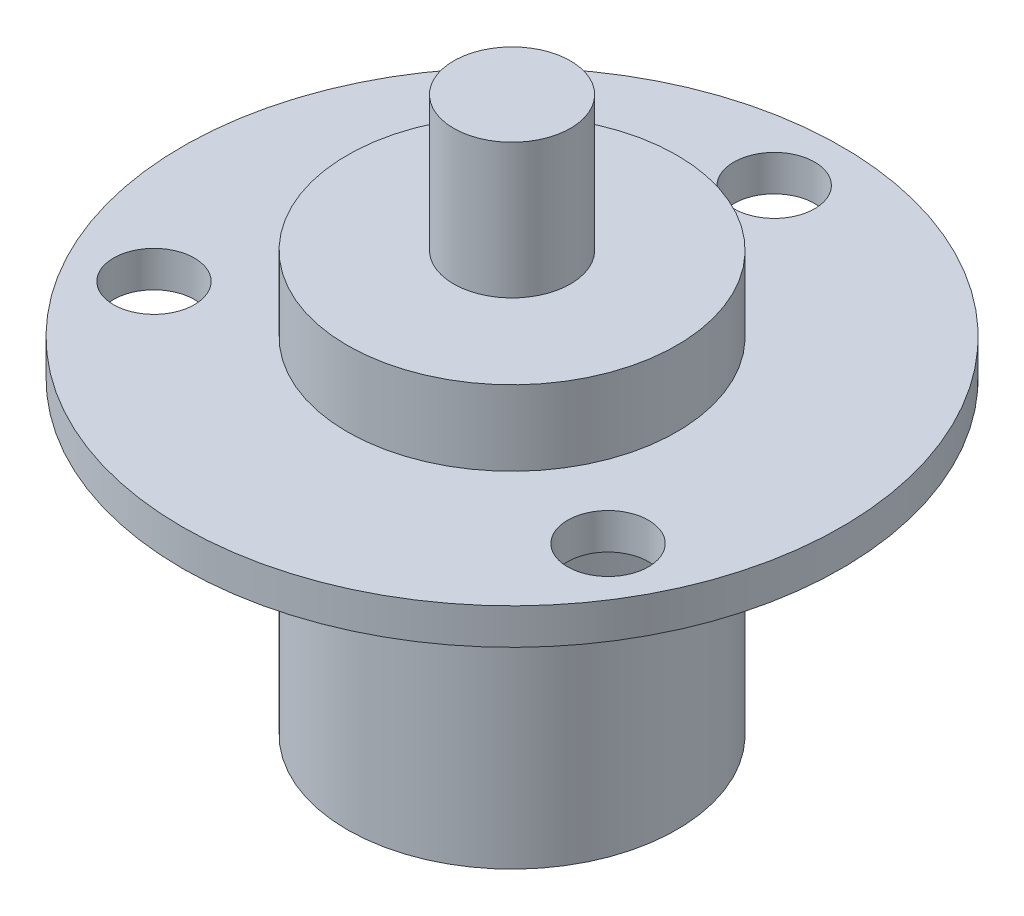
ISO-10303-21;
HEADER;
FILE_DESCRIPTION(('STEP AP214'),'2;1');
FILE_NAME('part.step','',(''),(''),'','','');
FILE_SCHEMA(('AUTOMOTIVE_DESIGN { 1 0 10303 214 1 1 1 1 }'));
ENDSEC;
DATA;
#1=APPLICATION_CONTEXT('core data for automotive mechanical design processes');
#2=APPLICATION_PROTOCOL_DEFINITION('international standard','automotive_design',2000,#1);
#3=PRODUCT_CONTEXT('',#1,'mechanical');
#4=PRODUCT('Part','Part','',(#3));
#5=PRODUCT_RELATED_PRODUCT_CATEGORY('part','',(#4));
#6=PRODUCT_DEFINITION_FORMATION('','',#4);
#7=PRODUCT_DEFINITION_CONTEXT('part definition',#1,'design');
#8=PRODUCT_DEFINITION('design','',#6,#7);
#9=PRODUCT_DEFINITION_SHAPE('','',#8);
#10=(LENGTH_UNIT() NAMED_UNIT(*) SI_UNIT(.MILLI.,.METRE.));
#11=(NAMED_UNIT(*) PLANE_ANGLE_UNIT() SI_UNIT($,.RADIAN.));
#12=(NAMED_UNIT(*) SI_UNIT($,.STERADIAN.) SOLID_ANGLE_UNIT());
#13=UNCERTAINTY_MEASURE_WITH_UNIT(LENGTH_MEASURE(1.E-05),#10,'distance_accuracy_value','');
#14=(GEOMETRIC_REPRESENTATION_CONTEXT(3) GLOBAL_UNCERTAINTY_ASSIGNED_CONTEXT((#13)) GLOBAL_UNIT_ASSIGNED_CONTEXT((#10,
#11,#12)) REPRESENTATION_CONTEXT('',''));
#15=CARTESIAN_POINT('',(0.,0.,0.));
#16=DIRECTION('',(0.,0.,1.));
#17=DIRECTION('',(1.,0.,0.));
#18=AXIS2_PLACEMENT_3D('',#15,#16,#17);
#19=CARTESIAN_POINT('',(0.,2.4,0.));
#20=DIRECTION('',(0.,-1.,0.));
#21=DIRECTION('',(0.,0.,-1.));
#22=AXIS2_PLACEMENT_3D('',#19,#20,#21);
#23=CYLINDRICAL_SURFACE('',#22,22.);
#24=CARTESIAN_POINT('',(0.,2.4,0.));
#25=DIRECTION('',(0.,1.,0.));
#26=DIRECTION('',(0.,0.,1.));
#27=AXIS2_PLACEMENT_3D('',#24,#25,#26);
#28=CIRCLE('',#27,22.);
#29=CARTESIAN_POINT('',(0.,2.4,22.));
#30=VERTEX_POINT('',#29);
#31=EDGE_CURVE('E38',#30,#30,#28,.T.);
#32=ORIENTED_EDGE('',*,*,#31,.F.);
#33=EDGE_LOOP('',(#32));
#34=FACE_BOUND('',#33,.T.);
#35=CARTESIAN_POINT('',(0.,0.,0.));
#36=DIRECTION('',(0.,1.,0.));
#37=DIRECTION('',(0.,0.,1.));
#38=AXIS2_PLACEMENT_3D('',#35,#36,#37);
#39=CIRCLE('',#38,22.);
#40=CARTESIAN_POINT('',(0.,0.,22.));
#41=VERTEX_POINT('',#40);
#42=EDGE_CURVE('E43',#41,#41,#39,.T.);
#43=ORIENTED_EDGE('',*,*,#42,.T.);
#44=EDGE_LOOP('',(#43));
#45=FACE_BOUND('',#44,.T.);
#46=ADVANCED_FACE('F31',(#34,#45),#23,.T.);
#47=CARTESIAN_POINT('',(0.,2.4,0.));
#48=DIRECTION('',(0.,1.,0.));
#49=DIRECTION('',(0.,0.,1.));
#50=AXIS2_PLACEMENT_3D('',#47,#48,#49);
#51=PLANE('',#50);
#52=CARTESIAN_POINT('',(-15.1554445662276,2.4,8.75000000000007));
#53=DIRECTION('',(0.,1.,0.));
#54=DIRECTION('',(0.,0.,1.));
#55=AXIS2_PLACEMENT_3D('',#52,#53,#54);
#56=CIRCLE('',#55,2.7);
#57=CARTESIAN_POINT('',(-15.1554445662276,2.4,11.4500000000001));
#58=VERTEX_POINT('',#57);
#59=EDGE_CURVE('E53',#58,#58,#56,.T.);
#60=ORIENTED_EDGE('',*,*,#59,.F.);
#61=EDGE_LOOP('',(#60));
#62=FACE_BOUND('',#61,.T.);
#63=CARTESIAN_POINT('',(15.1554445662276,2.4,8.75000000000007));
#64=DIRECTION('',(0.,1.,0.));
#65=DIRECTION('',(0.,0.,1.));
#66=AXIS2_PLACEMENT_3D('',#63,#64,#65);
#67=CIRCLE('',#66,2.7);
#68=CARTESIAN_POINT('',(15.1554445662276,2.4,11.4500000000001));
#69=VERTEX_POINT('',#68);
#70=EDGE_CURVE('E58',#69,#69,#67,.T.);
#71=ORIENTED_EDGE('',*,*,#70,.F.);
#72=EDGE_LOOP('',(#71));
#73=FACE_BOUND('',#72,.T.);
#74=CARTESIAN_POINT('',(0.,2.4,-17.5));
#75=DIRECTION('',(0.,1.,0.));
#76=DIRECTION('',(0.,0.,1.));
#77=AXIS2_PLACEMENT_3D('',#74,#75,#76);
#78=CIRCLE('',#77,2.7);
#79=CARTESIAN_POINT('',(0.,2.4,-14.8));
#80=VERTEX_POINT('',#79);
#81=EDGE_CURVE('E50',#80,#80,#78,.T.);
#82=ORIENTED_EDGE('',*,*,#81,.F.);
#83=EDGE_LOOP('',(#82));
#84=FACE_BOUND('',#83,.T.);
#85=CARTESIAN_POINT('',(0.,2.4,0.));
#86=DIRECTION('',(0.,1.,0.));
#87=DIRECTION('',(0.,0.,1.));
#88=AXIS2_PLACEMENT_3D('',#85,#86,#87);
#89=CIRCLE('',#88,11.);
#90=CARTESIAN_POINT('',(0.,2.4,11.));
#91=VERTEX_POINT('',#90);
#92=EDGE_CURVE('E73',#91,#91,#89,.T.);
#93=ORIENTED_EDGE('',*,*,#92,.F.);
#94=EDGE_LOOP('',(#93));
#95=FACE_BOUND('',#94,.T.);
#96=ORIENTED_EDGE('',*,*,#31,.T.);
#97=EDGE_LOOP('',(#96));
#98=FACE_BOUND('',#97,.T.);
#99=ADVANCED_FACE('F84',(#62,#73,#84,#95,#98),#51,.T.);
#100=CARTESIAN_POINT('',(0.,0.,0.));
#101=DIRECTION('',(0.,1.,0.));
#102=DIRECTION('',(0.,0.,1.));
#103=AXIS2_PLACEMENT_3D('',#100,#101,#102);
#104=PLANE('',#103);
#105=CARTESIAN_POINT('',(-15.1554445662276,0.,8.75000000000007));
#106=DIRECTION('',(0.,1.,0.));
#107=DIRECTION('',(0.,0.,1.));
#108=AXIS2_PLACEMENT_3D('',#105,#106,#107);
#109=CIRCLE('',#108,2.7);
#110=CARTESIAN_POINT('',(-15.1554445662276,0.,11.4500000000001));
#111=VERTEX_POINT('',#110);
#112=EDGE_CURVE('E34',#111,#111,#109,.T.);
#113=ORIENTED_EDGE('',*,*,#112,.T.);
#114=EDGE_LOOP('',(#113));
#115=FACE_BOUND('',#114,.T.);
#116=CARTESIAN_POINT('',(15.1554445662276,0.,8.75000000000007));
#117=DIRECTION('',(0.,1.,0.));
#118=DIRECTION('',(0.,0.,1.));
#119=AXIS2_PLACEMENT_3D('',#116,#117,#118);
#120=CIRCLE('',#119,2.7);
#121=CARTESIAN_POINT('',(15.1554445662276,0.,11.4500000000001));
#122=VERTEX_POINT('',#121);
#123=EDGE_CURVE('E51',#122,#122,#120,.T.);
#124=ORIENTED_EDGE('',*,*,#123,.T.);
#125=EDGE_LOOP('',(#124));
#126=FACE_BOUND('',#125,.T.);
#127=CARTESIAN_POINT('',(0.,0.,-17.5));
#128=DIRECTION('',(0.,1.,0.));
#129=DIRECTION('',(0.,0.,1.));
#130=AXIS2_PLACEMENT_3D('',#127,#128,#129);
#131=CIRCLE('',#130,2.7);
#132=CARTESIAN_POINT('',(0.,0.,-14.8));
#133=VERTEX_POINT('',#132);
#134=EDGE_CURVE('E47',#133,#133,#131,.T.);
#135=ORIENTED_EDGE('',*,*,#134,.T.);
#136=EDGE_LOOP('',(#135));
#137=FACE_BOUND('',#136,.T.);
#138=CARTESIAN_POINT('',(0.,0.,0.));
#139=DIRECTION('',(0.,1.,0.));
#140=DIRECTION('',(0.,0.,1.));
#141=AXIS2_PLACEMENT_3D('',#138,#139,#140);
#142=CIRCLE('',#141,11.);
#143=CARTESIAN_POINT('',(0.,0.,11.));
#144=VERTEX_POINT('',#143);
#145=EDGE_CURVE('E10',#144,#144,#142,.F.);
#146=ORIENTED_EDGE('',*,*,#145,.F.);
#147=EDGE_LOOP('',(#146));
#148=FACE_BOUND('',#147,.T.);
#149=ORIENTED_EDGE('',*,*,#42,.F.);
#150=EDGE_LOOP('',(#149));
#151=FACE_BOUND('',#150,.T.);
#152=ADVANCED_FACE('F87',(#115,#126,#137,#148,#151),#104,.F.);
#153=CARTESIAN_POINT('',(0.,7.4,0.));
#154=DIRECTION('',(0.,-1.,0.));
#155=DIRECTION('',(0.,0.,-1.));
#156=AXIS2_PLACEMENT_3D('',#153,#154,#155);
#157=CYLINDRICAL_SURFACE('',#156,11.);
#158=CARTESIAN_POINT('',(0.,7.4,0.));
#159=DIRECTION('',(0.,1.,0.));
#160=DIRECTION('',(0.,0.,1.));
#161=AXIS2_PLACEMENT_3D('',#158,#159,#160);
#162=CIRCLE('',#161,11.);
#163=CARTESIAN_POINT('',(0.,7.4,11.));
#164=VERTEX_POINT('',#163);
#165=EDGE_CURVE('E76',#164,#164,#162,.T.);
#166=ORIENTED_EDGE('',*,*,#165,.F.);
#167=EDGE_LOOP('',(#166));
#168=FACE_BOUND('',#167,.T.);
#169=ORIENTED_EDGE('',*,*,#92,.T.);
#170=EDGE_LOOP('',(#169));
#171=FACE_BOUND('',#170,.T.);
#172=ADVANCED_FACE('F82',(#168,#171),#157,.T.);
#173=CARTESIAN_POINT('',(0.,7.4,0.));
#174=DIRECTION('',(0.,1.,0.));
#175=DIRECTION('',(0.,0.,1.));
#176=AXIS2_PLACEMENT_3D('',#173,#174,#175);
#177=PLANE('',#176);
#178=CARTESIAN_POINT('',(0.,7.4,0.));
#179=DIRECTION('',(0.,1.,0.));
#180=DIRECTION('',(0.,0.,1.));
#181=AXIS2_PLACEMENT_3D('',#178,#179,#180);
#182=CIRCLE('',#181,3.9);
#183=CARTESIAN_POINT('',(0.,7.4,3.9));
#184=VERTEX_POINT('',#183);
#185=EDGE_CURVE('E69',#184,#184,#182,.T.);
#186=ORIENTED_EDGE('',*,*,#185,.F.);
#187=EDGE_LOOP('',(#186));
#188=FACE_BOUND('',#187,.T.);
#189=ORIENTED_EDGE('',*,*,#165,.T.);
#190=EDGE_LOOP('',(#189));
#191=FACE_BOUND('',#190,.T.);
#192=ADVANCED_FACE('F102',(#188,#191),#177,.T.);
#193=CARTESIAN_POINT('',(0.,16.4,0.));
#194=DIRECTION('',(0.,-1.,0.));
#195=DIRECTION('',(0.,0.,-1.));
#196=AXIS2_PLACEMENT_3D('',#193,#194,#195);
#197=CYLINDRICAL_SURFACE('',#196,3.9);
#198=CARTESIAN_POINT('',(0.,16.4,0.));
#199=DIRECTION('',(0.,1.,0.));
#200=DIRECTION('',(0.,0.,1.));
#201=AXIS2_PLACEMENT_3D('',#198,#199,#200);
#202=CIRCLE('',#201,3.9);
#203=CARTESIAN_POINT('',(0.,16.4,3.9));
#204=VERTEX_POINT('',#203);
#205=EDGE_CURVE('E70',#204,#204,#202,.T.);
#206=ORIENTED_EDGE('',*,*,#205,.F.);
#207=EDGE_LOOP('',(#206));
#208=FACE_BOUND('',#207,.T.);
#209=ORIENTED_EDGE('',*,*,#185,.T.);
#210=EDGE_LOOP('',(#209));
#211=FACE_BOUND('',#210,.T.);
#212=ADVANCED_FACE('F108',(#208,#211),#197,.T.);
#213=CARTESIAN_POINT('',(0.,16.4,0.));
#214=DIRECTION('',(0.,1.,0.));
#215=DIRECTION('',(0.,0.,1.));
#216=AXIS2_PLACEMENT_3D('',#213,#214,#215);
#217=PLANE('',#216);
#218=ORIENTED_EDGE('',*,*,#205,.T.);
#219=EDGE_LOOP('',(#218));
#220=FACE_BOUND('',#219,.T.);
#221=ADVANCED_FACE('F112',(#220),#217,.T.);
#222=CARTESIAN_POINT('',(0.,-20.6,0.));
#223=DIRECTION('',(0.,1.,0.));
#224=DIRECTION('',(0.,0.,1.));
#225=AXIS2_PLACEMENT_3D('',#222,#223,#224);
#226=CYLINDRICAL_SURFACE('',#225,11.);
#227=CARTESIAN_POINT('',(0.,-20.6,0.));
#228=DIRECTION('',(0.,-1.,0.));
#229=DIRECTION('',(0.,0.,-1.));
#230=AXIS2_PLACEMENT_3D('',#227,#228,#229);
#231=CIRCLE('',#230,11.);
#232=CARTESIAN_POINT('',(0.,-20.6,11.));
#233=VERTEX_POINT('',#232);
#234=EDGE_CURVE('E49',#233,#233,#231,.T.);
#235=CARTESIAN_POINT('',(0.,-20.6,11.));
#236=CARTESIAN_POINT('',(0.,-20.3854166666667,11.));
#237=CARTESIAN_POINT('',(0.,-20.1708333333333,11.));
#238=CARTESIAN_POINT('',(0.,-19.7416666666667,11.));
#239=CARTESIAN_POINT('',(0.,-19.5270833333333,11.));
#240=CARTESIAN_POINT('',(0.,-19.0979166666667,11.));
#241=CARTESIAN_POINT('',(0.,-18.8833333333333,11.));
#242=CARTESIAN_POINT('',(0.,-18.4541666666667,11.));
#243=CARTESIAN_POINT('',(0.,-18.2395833333333,11.));
#244=CARTESIAN_POINT('',(0.,-17.8104166666667,11.));
#245=CARTESIAN_POINT('',(0.,-17.5958333333333,11.));
#246=CARTESIAN_POINT('',(0.,-17.1666666666667,11.));
#247=CARTESIAN_POINT('',(0.,-16.9520833333333,11.));
#248=CARTESIAN_POINT('',(0.,-16.5229166666667,11.));
#249=CARTESIAN_POINT('',(0.,-16.3083333333333,11.));
#250=CARTESIAN_POINT('',(0.,-15.8791666666667,11.));
#251=CARTESIAN_POINT('',(0.,-15.6645833333333,11.));
#252=CARTESIAN_POINT('',(0.,-15.2354166666667,11.));
#253=CARTESIAN_POINT('',(0.,-15.0208333333333,11.));
#254=CARTESIAN_POINT('',(0.,-14.5916666666667,11.));
#255=CARTESIAN_POINT('',(0.,-14.3770833333333,11.));
#256=CARTESIAN_POINT('',(0.,-13.9479166666667,11.));
#257=CARTESIAN_POINT('',(0.,-13.7333333333333,11.));
#258=CARTESIAN_POINT('',(0.,-13.3041666666667,11.));
#259=CARTESIAN_POINT('',(0.,-13.0895833333333,11.));
#260=CARTESIAN_POINT('',(0.,-12.6604166666667,11.));
#261=CARTESIAN_POINT('',(0.,-12.4458333333333,11.));
#262=CARTESIAN_POINT('',(0.,-12.0166666666667,11.));
#263=CARTESIAN_POINT('',(0.,-11.8020833333333,11.));
#264=CARTESIAN_POINT('',(0.,-11.3729166666667,11.));
#265=CARTESIAN_POINT('',(0.,-11.1583333333333,11.));
#266=CARTESIAN_POINT('',(0.,-10.7291666666667,11.));
#267=CARTESIAN_POINT('',(0.,-10.5145833333333,11.));
#268=CARTESIAN_POINT('',(0.,-10.0854166666667,11.));
#269=CARTESIAN_POINT('',(0.,-9.87083333333334,11.));
#270=CARTESIAN_POINT('',(0.,-9.44166666666667,11.));
#271=CARTESIAN_POINT('',(0.,-9.22708333333333,11.));
#272=CARTESIAN_POINT('',(0.,-8.79791666666667,11.));
#273=CARTESIAN_POINT('',(0.,-8.58333333333334,11.));
#274=CARTESIAN_POINT('',(0.,-8.15416666666667,11.));
#275=CARTESIAN_POINT('',(0.,-7.93958333333334,11.));
#276=CARTESIAN_POINT('',(0.,-7.51041666666667,11.));
#277=CARTESIAN_POINT('',(0.,-7.29583333333334,11.));
#278=CARTESIAN_POINT('',(0.,-6.86666666666667,11.));
#279=CARTESIAN_POINT('',(0.,-6.65208333333334,11.));
#280=CARTESIAN_POINT('',(0.,-6.22291666666667,11.));
#281=CARTESIAN_POINT('',(0.,-6.00833333333334,11.));
#282=CARTESIAN_POINT('',(0.,-5.57916666666667,11.));
#283=CARTESIAN_POINT('',(0.,-5.36458333333333,11.));
#284=CARTESIAN_POINT('',(0.,-4.93541666666667,11.));
#285=CARTESIAN_POINT('',(0.,-4.72083333333334,11.));
#286=CARTESIAN_POINT('',(0.,-4.29166666666667,11.));
#287=CARTESIAN_POINT('',(0.,-4.07708333333334,11.));
#288=CARTESIAN_POINT('',(0.,-3.64791666666667,11.));
#289=CARTESIAN_POINT('',(0.,-3.43333333333334,11.));
#290=CARTESIAN_POINT('',(0.,-3.00416666666667,11.));
#291=CARTESIAN_POINT('',(0.,-2.78958333333334,11.));
#292=CARTESIAN_POINT('',(0.,-2.36041666666667,11.));
#293=CARTESIAN_POINT('',(0.,-2.14583333333334,11.));
#294=CARTESIAN_POINT('',(0.,-1.71666666666667,11.));
#295=CARTESIAN_POINT('',(0.,-1.50208333333334,11.));
#296=CARTESIAN_POINT('',(0.,-1.07291666666667,11.));
#297=CARTESIAN_POINT('',(0.,-0.858333333333336,11.));
#298=CARTESIAN_POINT('',(0.,-0.429166666666669,11.));
#299=CARTESIAN_POINT('',(0.,-0.214583333333336,11.));
#300=CARTESIAN_POINT('',(0.,0.,11.));
#301=B_SPLINE_CURVE_WITH_KNOTS('',3,(#235,#236,#237,#238,#239,#240,#241,#242,#243,#244,#245,
#246,#247,#248,#249,#250,#251,#252,#253,#254,#255,#256,#257,#258,#259,#260,#261,#262,#263,#264,
#265,#266,#267,#268,#269,#270,#271,#272,#273,#274,#275,#276,#277,#278,#279,#280,#281,#282,#283,
#284,#285,#286,#287,#288,#289,#290,#291,#292,#293,#294,#295,#296,#297,#298,#299,#300),
.UNSPECIFIED.,.F.,.F.,(4,2,2,2,2,2,2,2,2,2,2,2,2,2,2,2,2,2,2,2,2,2,2,2,2,2,2,2,2,2,2,2,4),(0.,
0.643749999999998,1.2875,1.93125,2.575,3.21875,3.8625,4.50625,5.15,5.79375,6.4375,7.08125,7.725,
8.36875,9.01249999999999,9.65624999999999,10.3,10.94375,11.5875,12.23125,12.875,13.51875,
14.1625,14.80625,15.45,16.09375,16.7375,17.38125,18.025,18.66875,19.3125,19.95625,20.6),.UNSPECIFIED.);
#302=EDGE_CURVE('BSEAM116',#233,#144,#301,.T.);
#303=ORIENTED_EDGE('',*,*,#234,.F.);
#304=ORIENTED_EDGE('',*,*,#145,.T.);
#305=ORIENTED_EDGE('',*,*,#302,.T.);
#306=ORIENTED_EDGE('',*,*,#302,.F.);
#307=EDGE_LOOP('',(#303,#305,#304,#306));
#308=FACE_BOUND('',#307,.T.);
#309=ADVANCED_FACE('F116',(#308),#226,.T.);
#310=CARTESIAN_POINT('',(0.,-20.6,0.));
#311=DIRECTION('',(0.,-1.,0.));
#312=DIRECTION('',(0.,0.,-1.));
#313=AXIS2_PLACEMENT_3D('',#310,#311,#312);
#314=PLANE('',#313);
#315=ORIENTED_EDGE('',*,*,#234,.T.);
#316=EDGE_LOOP('',(#315));
#317=FACE_BOUND('',#316,.T.);
#318=ADVANCED_FACE('F120',(#317),#314,.T.);
#319=CARTESIAN_POINT('',(0.,-20.6,-17.5));
#320=DIRECTION('',(0.,1.,0.));
#321=DIRECTION('',(0.,0.,1.));
#322=AXIS2_PLACEMENT_3D('',#319,#320,#321);
#323=CYLINDRICAL_SURFACE('',#322,2.7);
#324=ORIENTED_EDGE('',*,*,#81,.T.);
#325=EDGE_LOOP('',(#324));
#326=FACE_BOUND('',#325,.T.);
#327=ORIENTED_EDGE('',*,*,#134,.F.);
#328=EDGE_LOOP('',(#327));
#329=FACE_BOUND('',#328,.T.);
#330=ADVANCED_FACE('F124',(#326,#329),#323,.F.);
#331=CARTESIAN_POINT('',(15.1554445662276,-20.6,8.75000000000007));
#332=DIRECTION('',(0.,1.,0.));
#333=DIRECTION('',(0.,0.,1.));
#334=AXIS2_PLACEMENT_3D('',#331,#332,#333);
#335=CYLINDRICAL_SURFACE('',#334,2.7);
#336=ORIENTED_EDGE('',*,*,#70,.T.);
#337=EDGE_LOOP('',(#336));
#338=FACE_BOUND('',#337,.T.);
#339=ORIENTED_EDGE('',*,*,#123,.F.);
#340=EDGE_LOOP('',(#339));
#341=FACE_BOUND('',#340,.T.);
#342=ADVANCED_FACE('F128',(#338,#341),#335,.F.);
#343=CARTESIAN_POINT('',(-15.1554445662276,-20.6,8.75000000000007));
#344=DIRECTION('',(0.,1.,0.));
#345=DIRECTION('',(0.,0.,1.));
#346=AXIS2_PLACEMENT_3D('',#343,#344,#345);
#347=CYLINDRICAL_SURFACE('',#346,2.7);
#348=ORIENTED_EDGE('',*,*,#59,.T.);
#349=EDGE_LOOP('',(#348));
#350=FACE_BOUND('',#349,.T.);
#351=ORIENTED_EDGE('',*,*,#112,.F.);
#352=EDGE_LOOP('',(#351));
#353=FACE_BOUND('',#352,.T.);
#354=ADVANCED_FACE('F132',(#350,#353),#347,.F.);
#355=CLOSED_SHELL('',(#46,#99,#152,#172,#192,#212,#221,#309,#318,#330,#342,#354));
#356=MANIFOLD_SOLID_BREP('B2',#355);
#357=ADVANCED_BREP_SHAPE_REPRESENTATION('',(#18,#356),#14);
#358=SHAPE_DEFINITION_REPRESENTATION(#9,#357);
ENDSEC;
END-ISO-10303-21;
